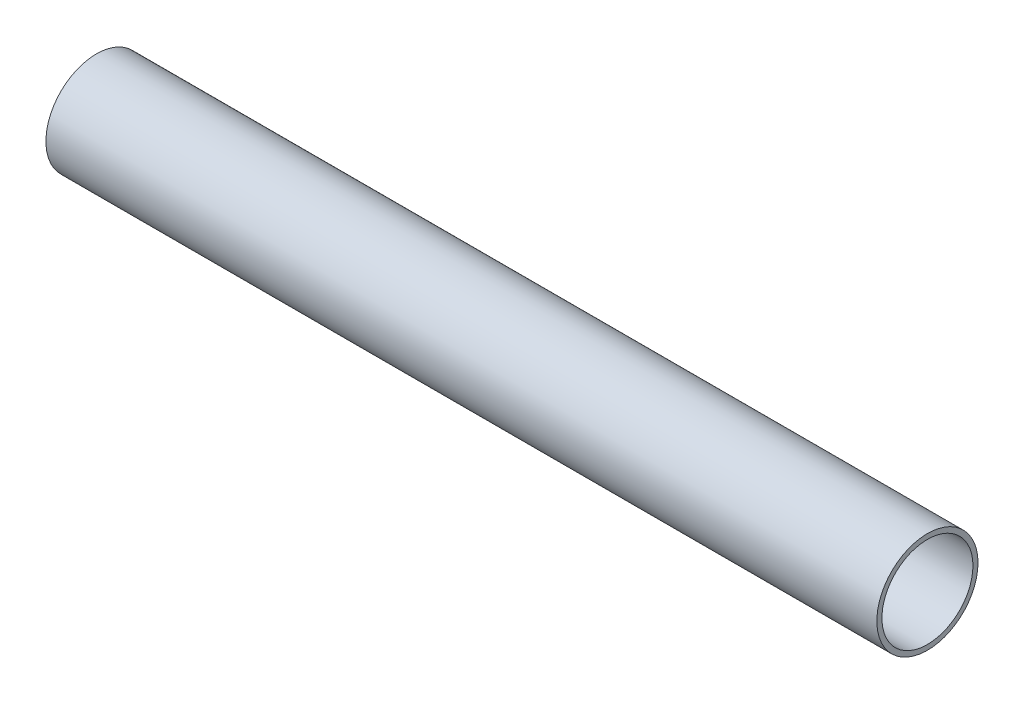
ISO-10303-21;
HEADER;
FILE_DESCRIPTION(('STEP AP214'),'2;1');
FILE_NAME('part.step','',(''),(''),'','','');
FILE_SCHEMA(('AUTOMOTIVE_DESIGN { 1 0 10303 214 1 1 1 1 }'));
ENDSEC;
DATA;
#1=APPLICATION_CONTEXT('core data for automotive mechanical design processes');
#2=APPLICATION_PROTOCOL_DEFINITION('international standard','automotive_design',2000,#1);
#3=PRODUCT_CONTEXT('',#1,'mechanical');
#4=PRODUCT('Part','Part','',(#3));
#5=PRODUCT_RELATED_PRODUCT_CATEGORY('part','',(#4));
#6=PRODUCT_DEFINITION_FORMATION('','',#4);
#7=PRODUCT_DEFINITION_CONTEXT('part definition',#1,'design');
#8=PRODUCT_DEFINITION('design','',#6,#7);
#9=PRODUCT_DEFINITION_SHAPE('','',#8);
#10=(LENGTH_UNIT() NAMED_UNIT(*) SI_UNIT(.MILLI.,.METRE.));
#11=(NAMED_UNIT(*) PLANE_ANGLE_UNIT() SI_UNIT($,.RADIAN.));
#12=(NAMED_UNIT(*) SI_UNIT($,.STERADIAN.) SOLID_ANGLE_UNIT());
#13=UNCERTAINTY_MEASURE_WITH_UNIT(LENGTH_MEASURE(1.E-05),#10,'distance_accuracy_value','');
#14=(GEOMETRIC_REPRESENTATION_CONTEXT(3) GLOBAL_UNCERTAINTY_ASSIGNED_CONTEXT((#13)) GLOBAL_UNIT_ASSIGNED_CONTEXT((#10,
#11,#12)) REPRESENTATION_CONTEXT('',''));
#15=CARTESIAN_POINT('',(0.,0.,0.));
#16=DIRECTION('',(0.,0.,1.));
#17=DIRECTION('',(1.,0.,0.));
#18=AXIS2_PLACEMENT_3D('',#15,#16,#17);
#19=CARTESIAN_POINT('',(130.4000059,0.,0.));
#20=DIRECTION('',(1.,0.,0.));
#21=DIRECTION('',(0.,0.,-1.));
#22=AXIS2_PLACEMENT_3D('',#19,#20,#21);
#23=PLANE('',#22);
#24=CARTESIAN_POINT('',(130.4000059,0.,0.));
#25=DIRECTION('',(1.,0.,0.));
#26=DIRECTION('',(0.,0.,-1.));
#27=AXIS2_PLACEMENT_3D('',#24,#25,#26);
#28=CIRCLE('',#27,15.875);
#29=CARTESIAN_POINT('',(130.4000059,0.,-15.875));
#30=VERTEX_POINT('',#29);
#31=EDGE_CURVE('E11',#30,#30,#28,.T.);
#32=ORIENTED_EDGE('',*,*,#31,.T.);
#33=EDGE_LOOP('',(#32));
#34=FACE_BOUND('',#33,.T.);
#35=CARTESIAN_POINT('',(130.4000059,0.,0.));
#36=DIRECTION('',(1.,0.,0.));
#37=DIRECTION('',(0.,0.,-1.));
#38=AXIS2_PLACEMENT_3D('',#35,#36,#37);
#39=CIRCLE('',#38,14.2875);
#40=CARTESIAN_POINT('',(130.4000059,0.,-14.2875));
#41=VERTEX_POINT('',#40);
#42=EDGE_CURVE('E52',#41,#41,#39,.T.);
#43=ORIENTED_EDGE('',*,*,#42,.F.);
#44=EDGE_LOOP('',(#43));
#45=FACE_BOUND('',#44,.T.);
#46=ADVANCED_FACE('F41',(#34,#45),#23,.T.);
#47=CARTESIAN_POINT('',(-130.4000059,0.,0.));
#48=DIRECTION('',(1.,0.,0.));
#49=DIRECTION('',(0.,0.,-1.));
#50=AXIS2_PLACEMENT_3D('',#47,#48,#49);
#51=PLANE('',#50);
#52=CARTESIAN_POINT('',(-130.4000059,0.,0.));
#53=DIRECTION('',(1.,0.,0.));
#54=DIRECTION('',(0.,0.,-1.));
#55=AXIS2_PLACEMENT_3D('',#52,#53,#54);
#56=CIRCLE('',#55,15.875);
#57=CARTESIAN_POINT('',(-130.4000059,0.,-15.875));
#58=VERTEX_POINT('',#57);
#59=EDGE_CURVE('E45',#58,#58,#56,.T.);
#60=ORIENTED_EDGE('',*,*,#59,.F.);
#61=EDGE_LOOP('',(#60));
#62=FACE_BOUND('',#61,.T.);
#63=CARTESIAN_POINT('',(-130.4000059,0.,0.));
#64=DIRECTION('',(1.,0.,0.));
#65=DIRECTION('',(0.,0.,-1.));
#66=AXIS2_PLACEMENT_3D('',#63,#64,#65);
#67=CIRCLE('',#66,14.2875);
#68=CARTESIAN_POINT('',(-130.4000059,0.,-14.2875));
#69=VERTEX_POINT('',#68);
#70=EDGE_CURVE('E54',#69,#69,#67,.T.);
#71=ORIENTED_EDGE('',*,*,#70,.T.);
#72=EDGE_LOOP('',(#71));
#73=FACE_BOUND('',#72,.T.);
#74=ADVANCED_FACE('F64',(#62,#73),#51,.F.);
#75=CARTESIAN_POINT('',(130.4000059,0.,0.));
#76=DIRECTION('',(-1.,0.,0.));
#77=DIRECTION('',(0.,0.,1.));
#78=AXIS2_PLACEMENT_3D('',#75,#76,#77);
#79=CYLINDRICAL_SURFACE('',#78,15.875);
#80=ORIENTED_EDGE('',*,*,#31,.F.);
#81=EDGE_LOOP('',(#80));
#82=FACE_BOUND('',#81,.T.);
#83=ORIENTED_EDGE('',*,*,#59,.T.);
#84=EDGE_LOOP('',(#83));
#85=FACE_BOUND('',#84,.T.);
#86=ADVANCED_FACE('F43',(#82,#85),#79,.T.);
#87=CARTESIAN_POINT('',(130.4000059,0.,0.));
#88=DIRECTION('',(-1.,0.,0.));
#89=DIRECTION('',(0.,0.,1.));
#90=AXIS2_PLACEMENT_3D('',#87,#88,#89);
#91=CYLINDRICAL_SURFACE('',#90,14.2875);
#92=ORIENTED_EDGE('',*,*,#42,.T.);
#93=EDGE_LOOP('',(#92));
#94=FACE_BOUND('',#93,.T.);
#95=ORIENTED_EDGE('',*,*,#70,.F.);
#96=EDGE_LOOP('',(#95));
#97=FACE_BOUND('',#96,.T.);
#98=ADVANCED_FACE('F60',(#94,#97),#91,.F.);
#99=CLOSED_SHELL('',(#46,#74,#86,#98));
#100=MANIFOLD_SOLID_BREP('B2',#99);
#101=ADVANCED_BREP_SHAPE_REPRESENTATION('',(#18,#100),#14);
#102=SHAPE_DEFINITION_REPRESENTATION(#9,#101);
ENDSEC;
END-ISO-10303-21;
